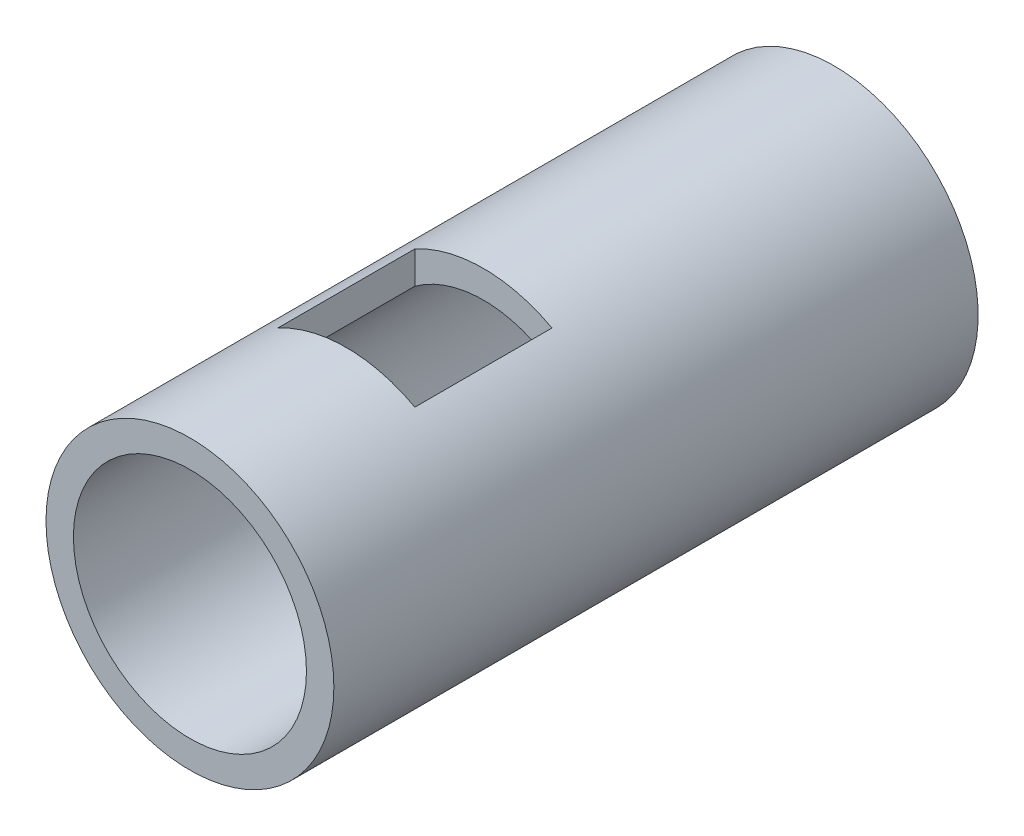
ISO-10303-21;
HEADER;
FILE_DESCRIPTION(('STEP AP214'),'2;1');
FILE_NAME('part.step','',(''),(''),'','','');
FILE_SCHEMA(('AUTOMOTIVE_DESIGN { 1 0 10303 214 1 1 1 1 }'));
ENDSEC;
DATA;
#1=APPLICATION_CONTEXT('core data for automotive mechanical design processes');
#2=APPLICATION_PROTOCOL_DEFINITION('international standard','automotive_design',2000,#1);
#3=PRODUCT_CONTEXT('',#1,'mechanical');
#4=PRODUCT('Part','Part','',(#3));
#5=PRODUCT_RELATED_PRODUCT_CATEGORY('part','',(#4));
#6=PRODUCT_DEFINITION_FORMATION('','',#4);
#7=PRODUCT_DEFINITION_CONTEXT('part definition',#1,'design');
#8=PRODUCT_DEFINITION('design','',#6,#7);
#9=PRODUCT_DEFINITION_SHAPE('','',#8);
#10=(LENGTH_UNIT() NAMED_UNIT(*) SI_UNIT(.MILLI.,.METRE.));
#11=(NAMED_UNIT(*) PLANE_ANGLE_UNIT() SI_UNIT($,.RADIAN.));
#12=(NAMED_UNIT(*) SI_UNIT($,.STERADIAN.) SOLID_ANGLE_UNIT());
#13=UNCERTAINTY_MEASURE_WITH_UNIT(LENGTH_MEASURE(1.E-05),#10,'distance_accuracy_value','');
#14=(GEOMETRIC_REPRESENTATION_CONTEXT(3) GLOBAL_UNCERTAINTY_ASSIGNED_CONTEXT((#13)) GLOBAL_UNIT_ASSIGNED_CONTEXT((#10,
#11,#12)) REPRESENTATION_CONTEXT('',''));
#15=CARTESIAN_POINT('',(0.,0.,0.));
#16=DIRECTION('',(0.,0.,1.));
#17=DIRECTION('',(1.,0.,0.));
#18=AXIS2_PLACEMENT_3D('',#15,#16,#17);
#19=CARTESIAN_POINT('',(0.,0.,45.));
#20=DIRECTION('',(0.,0.,-1.));
#21=DIRECTION('',(-1.,0.,0.));
#22=AXIS2_PLACEMENT_3D('',#19,#20,#21);
#23=CYLINDRICAL_SURFACE('',#22,10.5);
#24=CARTESIAN_POINT('',(0.,0.,45.));
#25=DIRECTION('',(0.,0.,1.));
#26=DIRECTION('',(1.,0.,0.));
#27=AXIS2_PLACEMENT_3D('',#24,#25,#26);
#28=CIRCLE('',#27,10.5);
#29=CARTESIAN_POINT('',(10.5,0.,45.));
#30=VERTEX_POINT('',#29);
#31=EDGE_CURVE('E137',#30,#30,#28,.T.);
#32=ORIENTED_EDGE('',*,*,#31,.F.);
#33=EDGE_LOOP('',(#32));
#34=FACE_BOUND('',#33,.T.);
#35=DIRECTION('',(0.,0.,-1.));
#36=VECTOR('',#35,1.);
#37=CARTESIAN_POINT('',(5.00000000000002,9.23309265630968,45.));
#38=LINE('',#37,#36);
#39=CARTESIAN_POINT('',(5.00000000000001,9.23309265630969,33.5891591497128));
#40=VERTEX_POINT('',#39);
#41=CARTESIAN_POINT('',(5.00000000000001,9.23309265630969,23.5891591497128));
#42=VERTEX_POINT('',#41);
#43=EDGE_CURVE('E132',#40,#42,#38,.T.);
#44=ORIENTED_EDGE('',*,*,#43,.F.);
#45=CARTESIAN_POINT('',(0.,0.,33.5891591497128));
#46=DIRECTION('',(0.,0.,-1.));
#47=DIRECTION('',(-1.,0.,0.));
#48=AXIS2_PLACEMENT_3D('',#45,#46,#47);
#49=CIRCLE('',#48,10.5);
#50=CARTESIAN_POINT('',(-4.99999999999999,9.2330926563097,33.5891591497128));
#51=VERTEX_POINT('',#50);
#52=EDGE_CURVE('E126',#51,#40,#49,.T.);
#53=ORIENTED_EDGE('',*,*,#52,.F.);
#54=DIRECTION('',(0.,0.,-1.));
#55=VECTOR('',#54,1.);
#56=CARTESIAN_POINT('',(-4.99999999999998,9.2330926563097,45.));
#57=LINE('',#56,#55);
#58=CARTESIAN_POINT('',(-4.99999999999999,9.2330926563097,23.5891591497128));
#59=VERTEX_POINT('',#58);
#60=EDGE_CURVE('E128',#59,#51,#57,.F.);
#61=ORIENTED_EDGE('',*,*,#60,.F.);
#62=CARTESIAN_POINT('',(0.,0.,23.5891591497128));
#63=DIRECTION('',(0.,0.,1.));
#64=DIRECTION('',(1.,0.,0.));
#65=AXIS2_PLACEMENT_3D('',#62,#63,#64);
#66=CIRCLE('',#65,10.5);
#67=EDGE_CURVE('E130',#42,#59,#66,.T.);
#68=ORIENTED_EDGE('',*,*,#67,.F.);
#69=EDGE_LOOP('',(#44,#53,#61,#68));
#70=FACE_BOUND('',#69,.T.);
#71=CARTESIAN_POINT('',(0.,0.,-2.));
#72=DIRECTION('',(0.,0.,-1.));
#73=DIRECTION('',(-1.,0.,0.));
#74=AXIS2_PLACEMENT_3D('',#71,#72,#73);
#75=CIRCLE('',#74,10.5);
#76=CARTESIAN_POINT('',(-10.5,0.,-2.));
#77=VERTEX_POINT('',#76);
#78=EDGE_CURVE('E104',#77,#77,#75,.T.);
#79=ORIENTED_EDGE('',*,*,#78,.F.);
#80=EDGE_LOOP('',(#79));
#81=FACE_BOUND('',#80,.T.);
#82=ADVANCED_FACE('F42',(#34,#70,#81),#23,.T.);
#83=CARTESIAN_POINT('',(0.,0.,45.));
#84=DIRECTION('',(0.,0.,-1.));
#85=DIRECTION('',(-1.,0.,0.));
#86=AXIS2_PLACEMENT_3D('',#83,#84,#85);
#87=CYLINDRICAL_SURFACE('',#86,8.5);
#88=CARTESIAN_POINT('',(0.,0.,45.));
#89=DIRECTION('',(0.,0.,1.));
#90=DIRECTION('',(1.,0.,0.));
#91=AXIS2_PLACEMENT_3D('',#88,#89,#90);
#92=CIRCLE('',#91,8.5);
#93=CARTESIAN_POINT('',(8.5,0.,45.));
#94=VERTEX_POINT('',#93);
#95=EDGE_CURVE('E134',#94,#94,#92,.T.);
#96=ORIENTED_EDGE('',*,*,#95,.T.);
#97=EDGE_LOOP('',(#96));
#98=FACE_BOUND('',#97,.T.);
#99=CARTESIAN_POINT('',(0.,0.,0.));
#100=DIRECTION('',(0.,0.,1.));
#101=DIRECTION('',(1.,0.,0.));
#102=AXIS2_PLACEMENT_3D('',#99,#100,#101);
#103=CIRCLE('',#102,8.5);
#104=CARTESIAN_POINT('',(8.5,0.,0.));
#105=VERTEX_POINT('',#104);
#106=CARTESIAN_POINT('',(-8.5,0.,0.));
#107=VERTEX_POINT('',#106);
#108=EDGE_CURVE('E55',#105,#107,#103,.T.);
#109=ORIENTED_EDGE('',*,*,#108,.F.);
#110=DIRECTION('',(0.,0.,1.));
#111=VECTOR('',#110,1.);
#112=CARTESIAN_POINT('',(8.5,0.,-2.));
#113=LINE('',#112,#111);
#114=CARTESIAN_POINT('',(8.5,0.,-2.));
#115=VERTEX_POINT('',#114);
#116=EDGE_CURVE('E101',#115,#105,#113,.T.);
#117=ORIENTED_EDGE('',*,*,#116,.F.);
#118=CARTESIAN_POINT('',(0.,0.,-2.));
#119=DIRECTION('',(0.,0.,-1.));
#120=DIRECTION('',(-1.,0.,0.));
#121=AXIS2_PLACEMENT_3D('',#118,#119,#120);
#122=CIRCLE('',#121,8.5);
#123=CARTESIAN_POINT('',(-8.5,0.,-2.));
#124=VERTEX_POINT('',#123);
#125=EDGE_CURVE('E93',#124,#115,#122,.F.);
#126=ORIENTED_EDGE('',*,*,#125,.F.);
#127=DIRECTION('',(0.,0.,1.));
#128=VECTOR('',#127,1.);
#129=CARTESIAN_POINT('',(-8.5,0.,-2.));
#130=LINE('',#129,#128);
#131=EDGE_CURVE('E98',#124,#107,#130,.T.);
#132=ORIENTED_EDGE('',*,*,#131,.T.);
#133=EDGE_LOOP('',(#109,#117,#126,#132));
#134=FACE_BOUND('',#133,.T.);
#135=CARTESIAN_POINT('',(0.,0.,33.5891591497128));
#136=DIRECTION('',(0.,0.,-1.));
#137=DIRECTION('',(-1.,0.,0.));
#138=AXIS2_PLACEMENT_3D('',#135,#136,#137);
#139=CIRCLE('',#138,8.5);
#140=CARTESIAN_POINT('',(-4.99999999999999,6.87386354243377,33.5891591497128));
#141=VERTEX_POINT('',#140);
#142=CARTESIAN_POINT('',(5.00000000000001,6.87386354243375,33.5891591497128));
#143=VERTEX_POINT('',#142);
#144=EDGE_CURVE('E141',#141,#143,#139,.T.);
#145=ORIENTED_EDGE('',*,*,#144,.T.);
#146=DIRECTION('',(0.,0.,-1.));
#147=VECTOR('',#146,1.);
#148=CARTESIAN_POINT('',(5.00000000000002,6.87386354243375,45.));
#149=LINE('',#148,#147);
#150=CARTESIAN_POINT('',(5.00000000000001,6.87386354243376,23.5891591497128));
#151=VERTEX_POINT('',#150);
#152=EDGE_CURVE('E11',#143,#151,#149,.T.);
#153=ORIENTED_EDGE('',*,*,#152,.T.);
#154=CARTESIAN_POINT('',(0.,0.,23.5891591497128));
#155=DIRECTION('',(0.,0.,1.));
#156=DIRECTION('',(1.,0.,0.));
#157=AXIS2_PLACEMENT_3D('',#154,#155,#156);
#158=CIRCLE('',#157,8.5);
#159=CARTESIAN_POINT('',(-4.99999999999999,6.87386354243377,23.5891591497128));
#160=VERTEX_POINT('',#159);
#161=EDGE_CURVE('E49',#151,#160,#158,.T.);
#162=ORIENTED_EDGE('',*,*,#161,.T.);
#163=DIRECTION('',(0.,0.,-1.));
#164=VECTOR('',#163,1.);
#165=CARTESIAN_POINT('',(-4.99999999999998,6.87386354243377,45.));
#166=LINE('',#165,#164);
#167=EDGE_CURVE('E144',#160,#141,#166,.F.);
#168=ORIENTED_EDGE('',*,*,#167,.T.);
#169=EDGE_LOOP('',(#145,#153,#162,#168));
#170=FACE_BOUND('',#169,.T.);
#171=ADVANCED_FACE('F95',(#98,#134,#170),#87,.F.);
#172=CARTESIAN_POINT('',(0.,0.,45.));
#173=DIRECTION('',(0.,0.,1.));
#174=DIRECTION('',(1.,0.,0.));
#175=AXIS2_PLACEMENT_3D('',#172,#173,#174);
#176=PLANE('',#175);
#177=ORIENTED_EDGE('',*,*,#31,.T.);
#178=EDGE_LOOP('',(#177));
#179=FACE_BOUND('',#178,.T.);
#180=ORIENTED_EDGE('',*,*,#95,.F.);
#181=EDGE_LOOP('',(#180));
#182=FACE_BOUND('',#181,.T.);
#183=ADVANCED_FACE('F178',(#179,#182),#176,.T.);
#184=CARTESIAN_POINT('',(5.00000000000001,40.,23.5891591497128));
#185=DIRECTION('',(-1.,0.,0.));
#186=DIRECTION('',(0.,0.,1.));
#187=AXIS2_PLACEMENT_3D('',#184,#185,#186);
#188=PLANE('',#187);
#189=ORIENTED_EDGE('',*,*,#43,.T.);
#190=DIRECTION('',(0.,-1.,0.));
#191=VECTOR('',#190,1.);
#192=CARTESIAN_POINT('',(5.00000000000001,40.,23.5891591497128));
#193=LINE('',#192,#191);
#194=EDGE_CURVE('E123',#42,#151,#193,.T.);
#195=ORIENTED_EDGE('',*,*,#194,.T.);
#196=ORIENTED_EDGE('',*,*,#152,.F.);
#197=DIRECTION('',(0.,-1.,0.));
#198=VECTOR('',#197,1.);
#199=CARTESIAN_POINT('',(5.00000000000001,40.,33.5891591497128));
#200=LINE('',#199,#198);
#201=EDGE_CURVE('E113',#40,#143,#200,.T.);
#202=ORIENTED_EDGE('',*,*,#201,.F.);
#203=EDGE_LOOP('',(#189,#195,#196,#202));
#204=FACE_BOUND('',#203,.T.);
#205=ADVANCED_FACE('F154',(#204),#188,.T.);
#206=CARTESIAN_POINT('',(-4.99999999999999,40.,23.5891591497128));
#207=DIRECTION('',(0.,0.,1.));
#208=DIRECTION('',(1.,0.,0.));
#209=AXIS2_PLACEMENT_3D('',#206,#207,#208);
#210=PLANE('',#209);
#211=ORIENTED_EDGE('',*,*,#67,.T.);
#212=DIRECTION('',(0.,-1.,0.));
#213=VECTOR('',#212,1.);
#214=CARTESIAN_POINT('',(-4.99999999999999,40.,23.5891591497128));
#215=LINE('',#214,#213);
#216=EDGE_CURVE('E120',#59,#160,#215,.T.);
#217=ORIENTED_EDGE('',*,*,#216,.T.);
#218=ORIENTED_EDGE('',*,*,#161,.F.);
#219=ORIENTED_EDGE('',*,*,#194,.F.);
#220=EDGE_LOOP('',(#211,#217,#218,#219));
#221=FACE_BOUND('',#220,.T.);
#222=ADVANCED_FACE('F150',(#221),#210,.T.);
#223=CARTESIAN_POINT('',(-4.99999999999999,40.,23.5891591497128));
#224=DIRECTION('',(1.,0.,0.));
#225=DIRECTION('',(0.,0.,-1.));
#226=AXIS2_PLACEMENT_3D('',#223,#224,#225);
#227=PLANE('',#226);
#228=ORIENTED_EDGE('',*,*,#60,.T.);
#229=DIRECTION('',(0.,-1.,0.));
#230=VECTOR('',#229,1.);
#231=CARTESIAN_POINT('',(-4.99999999999999,40.,33.5891591497128));
#232=LINE('',#231,#230);
#233=EDGE_CURVE('E63',#51,#141,#232,.T.);
#234=ORIENTED_EDGE('',*,*,#233,.T.);
#235=ORIENTED_EDGE('',*,*,#167,.F.);
#236=ORIENTED_EDGE('',*,*,#216,.F.);
#237=EDGE_LOOP('',(#228,#234,#235,#236));
#238=FACE_BOUND('',#237,.T.);
#239=ADVANCED_FACE('F162',(#238),#227,.T.);
#240=CARTESIAN_POINT('',(-4.99999999999999,40.,33.5891591497128));
#241=DIRECTION('',(0.,0.,-1.));
#242=DIRECTION('',(-1.,0.,0.));
#243=AXIS2_PLACEMENT_3D('',#240,#241,#242);
#244=PLANE('',#243);
#245=ORIENTED_EDGE('',*,*,#52,.T.);
#246=ORIENTED_EDGE('',*,*,#201,.T.);
#247=ORIENTED_EDGE('',*,*,#144,.F.);
#248=ORIENTED_EDGE('',*,*,#233,.F.);
#249=EDGE_LOOP('',(#245,#246,#247,#248));
#250=FACE_BOUND('',#249,.T.);
#251=ADVANCED_FACE('F164',(#250),#244,.T.);
#252=CARTESIAN_POINT('',(0.,0.,0.));
#253=DIRECTION('',(0.,0.,-1.));
#254=DIRECTION('',(-1.,0.,0.));
#255=AXIS2_PLACEMENT_3D('',#252,#253,#254);
#256=PLANE('',#255);
#257=DIRECTION('',(-1.,0.,0.));
#258=VECTOR('',#257,1.);
#259=CARTESIAN_POINT('',(0.,0.,0.));
#260=LINE('',#259,#258);
#261=EDGE_CURVE('E110',#105,#107,#260,.T.);
#262=ORIENTED_EDGE('',*,*,#261,.F.);
#263=ORIENTED_EDGE('',*,*,#108,.T.);
#264=EDGE_LOOP('',(#262,#263));
#265=FACE_BOUND('',#264,.T.);
#266=ADVANCED_FACE('F170',(#265),#256,.F.);
#267=CARTESIAN_POINT('',(0.,0.,-2.));
#268=DIRECTION('',(0.,1.,0.));
#269=DIRECTION('',(0.,0.,1.));
#270=AXIS2_PLACEMENT_3D('',#267,#268,#269);
#271=PLANE('',#270);
#272=ORIENTED_EDGE('',*,*,#261,.T.);
#273=ORIENTED_EDGE('',*,*,#131,.F.);
#274=DIRECTION('',(-1.,0.,0.));
#275=VECTOR('',#274,1.);
#276=CARTESIAN_POINT('',(0.,0.,-2.));
#277=LINE('',#276,#275);
#278=EDGE_CURVE('E105',#115,#124,#277,.T.);
#279=ORIENTED_EDGE('',*,*,#278,.F.);
#280=ORIENTED_EDGE('',*,*,#116,.T.);
#281=EDGE_LOOP('',(#272,#273,#279,#280));
#282=FACE_BOUND('',#281,.T.);
#283=ADVANCED_FACE('F112',(#282),#271,.F.);
#284=CARTESIAN_POINT('',(0.,0.,-2.));
#285=DIRECTION('',(0.,0.,-1.));
#286=DIRECTION('',(-1.,0.,0.));
#287=AXIS2_PLACEMENT_3D('',#284,#285,#286);
#288=PLANE('',#287);
#289=ORIENTED_EDGE('',*,*,#278,.T.);
#290=ORIENTED_EDGE('',*,*,#125,.T.);
#291=EDGE_LOOP('',(#289,#290));
#292=FACE_BOUND('',#291,.T.);
#293=ORIENTED_EDGE('',*,*,#78,.T.);
#294=EDGE_LOOP('',(#293));
#295=FACE_BOUND('',#294,.T.);
#296=ADVANCED_FACE('F107',(#292,#295),#288,.T.);
#297=CLOSED_SHELL('',(#82,#171,#183,#205,#222,#239,#251,#266,#283,#296));
#298=MANIFOLD_SOLID_BREP('B2',#297);
#299=ADVANCED_BREP_SHAPE_REPRESENTATION('',(#18,#298),#14);
#300=SHAPE_DEFINITION_REPRESENTATION(#9,#299);
ENDSEC;
END-ISO-10303-21;
